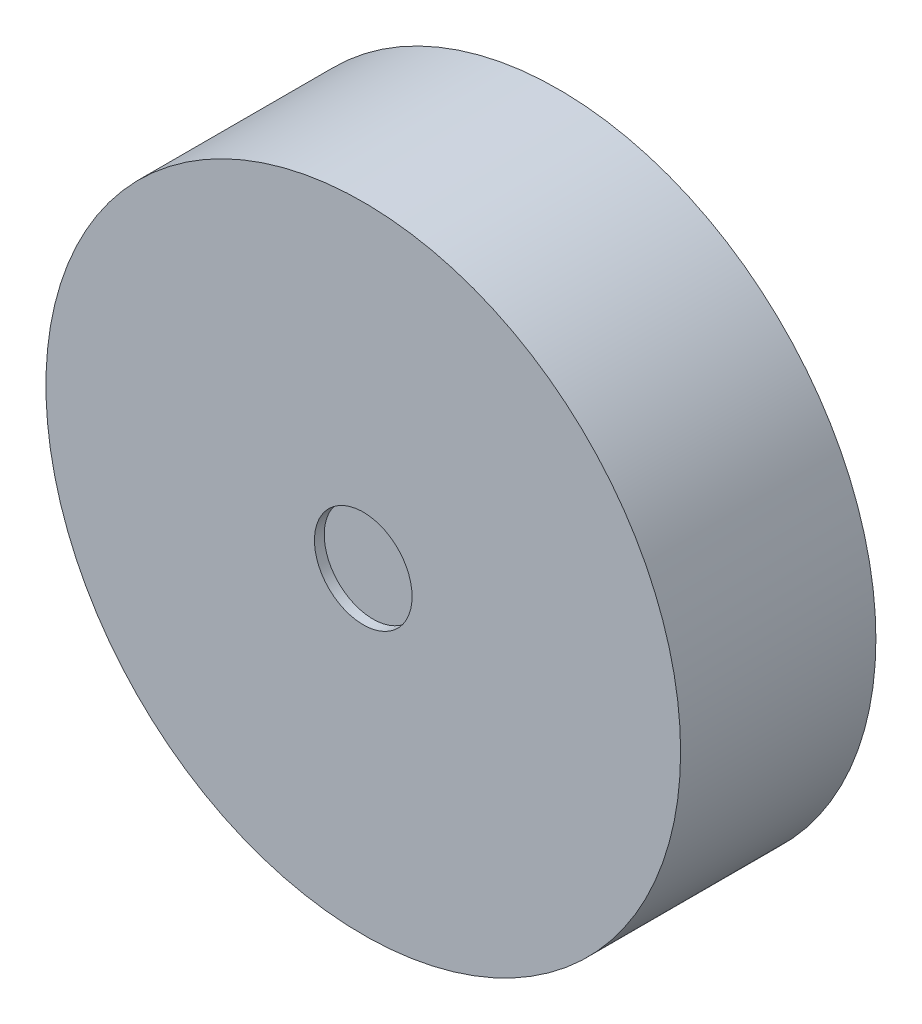
ISO-10303-21;
HEADER;
FILE_DESCRIPTION(('STEP AP214'),'2;1');
FILE_NAME('part.step','',(''),(''),'','','');
FILE_SCHEMA(('AUTOMOTIVE_DESIGN { 1 0 10303 214 1 1 1 1 }'));
ENDSEC;
DATA;
#1=APPLICATION_CONTEXT('core data for automotive mechanical design processes');
#2=APPLICATION_PROTOCOL_DEFINITION('international standard','automotive_design',2000,#1);
#3=PRODUCT_CONTEXT('',#1,'mechanical');
#4=PRODUCT('Part','Part','',(#3));
#5=PRODUCT_RELATED_PRODUCT_CATEGORY('part','',(#4));
#6=PRODUCT_DEFINITION_FORMATION('','',#4);
#7=PRODUCT_DEFINITION_CONTEXT('part definition',#1,'design');
#8=PRODUCT_DEFINITION('design','',#6,#7);
#9=PRODUCT_DEFINITION_SHAPE('','',#8);
#10=(LENGTH_UNIT() NAMED_UNIT(*) SI_UNIT(.MILLI.,.METRE.));
#11=(NAMED_UNIT(*) PLANE_ANGLE_UNIT() SI_UNIT($,.RADIAN.));
#12=(NAMED_UNIT(*) SI_UNIT($,.STERADIAN.) SOLID_ANGLE_UNIT());
#13=UNCERTAINTY_MEASURE_WITH_UNIT(LENGTH_MEASURE(1.E-05),#10,'distance_accuracy_value','');
#14=(GEOMETRIC_REPRESENTATION_CONTEXT(3) GLOBAL_UNCERTAINTY_ASSIGNED_CONTEXT((#13)) GLOBAL_UNIT_ASSIGNED_CONTEXT((#10,
#11,#12)) REPRESENTATION_CONTEXT('',''));
#15=CARTESIAN_POINT('',(0.,0.,0.));
#16=DIRECTION('',(0.,0.,1.));
#17=DIRECTION('',(1.,0.,0.));
#18=AXIS2_PLACEMENT_3D('',#15,#16,#17);
#19=CARTESIAN_POINT('',(0.,0.,20.));
#20=DIRECTION('',(0.,0.,-1.));
#21=DIRECTION('',(-1.,0.,0.));
#22=AXIS2_PLACEMENT_3D('',#19,#20,#21);
#23=CYLINDRICAL_SURFACE('',#22,32.5);
#24=CARTESIAN_POINT('',(0.,0.,20.));
#25=DIRECTION('',(0.,0.,1.));
#26=DIRECTION('',(1.,0.,0.));
#27=AXIS2_PLACEMENT_3D('',#24,#25,#26);
#28=CIRCLE('',#27,32.5);
#29=CARTESIAN_POINT('',(32.5,0.,20.));
#30=VERTEX_POINT('',#29);
#31=EDGE_CURVE('E10',#30,#30,#28,.T.);
#32=ORIENTED_EDGE('',*,*,#31,.F.);
#33=EDGE_LOOP('',(#32));
#34=FACE_BOUND('',#33,.T.);
#35=CARTESIAN_POINT('',(0.,0.,0.));
#36=DIRECTION('',(0.,0.,1.));
#37=DIRECTION('',(1.,0.,0.));
#38=AXIS2_PLACEMENT_3D('',#35,#36,#37);
#39=CIRCLE('',#38,32.5);
#40=CARTESIAN_POINT('',(32.5,0.,0.));
#41=VERTEX_POINT('',#40);
#42=EDGE_CURVE('E44',#41,#41,#39,.T.);
#43=ORIENTED_EDGE('',*,*,#42,.T.);
#44=EDGE_LOOP('',(#43));
#45=FACE_BOUND('',#44,.T.);
#46=ADVANCED_FACE('F36',(#34,#45),#23,.T.);
#47=CARTESIAN_POINT('',(0.,0.,20.));
#48=DIRECTION('',(0.,0.,1.));
#49=DIRECTION('',(1.,0.,0.));
#50=AXIS2_PLACEMENT_3D('',#47,#48,#49);
#51=PLANE('',#50);
#52=CARTESIAN_POINT('',(0.,0.,20.));
#53=DIRECTION('',(0.,0.,1.));
#54=DIRECTION('',(1.,0.,0.));
#55=AXIS2_PLACEMENT_3D('',#52,#53,#54);
#56=CIRCLE('',#55,5.);
#57=CARTESIAN_POINT('',(5.,0.,20.));
#58=VERTEX_POINT('',#57);
#59=EDGE_CURVE('E52',#58,#58,#56,.T.);
#60=ORIENTED_EDGE('',*,*,#59,.F.);
#61=EDGE_LOOP('',(#60));
#62=FACE_BOUND('',#61,.T.);
#63=ORIENTED_EDGE('',*,*,#31,.T.);
#64=EDGE_LOOP('',(#63));
#65=FACE_BOUND('',#64,.T.);
#66=ADVANCED_FACE('F124',(#62,#65),#51,.T.);
#67=CARTESIAN_POINT('',(0.,0.,0.));
#68=DIRECTION('',(0.,0.,1.));
#69=DIRECTION('',(1.,0.,0.));
#70=AXIS2_PLACEMENT_3D('',#67,#68,#69);
#71=PLANE('',#70);
#72=CARTESIAN_POINT('',(0.,0.,0.));
#73=DIRECTION('',(0.,0.,-1.));
#74=DIRECTION('',(-1.,0.,0.));
#75=AXIS2_PLACEMENT_3D('',#72,#73,#74);
#76=CIRCLE('',#75,5.);
#77=CARTESIAN_POINT('',(-5.,0.,0.));
#78=VERTEX_POINT('',#77);
#79=EDGE_CURVE('E95',#78,#78,#76,.T.);
#80=ORIENTED_EDGE('',*,*,#79,.F.);
#81=EDGE_LOOP('',(#80));
#82=FACE_BOUND('',#81,.T.);
#83=CARTESIAN_POINT('',(5.5,9.,0.));
#84=DIRECTION('',(0.,0.,-1.));
#85=DIRECTION('',(-1.,0.,0.));
#86=AXIS2_PLACEMENT_3D('',#83,#84,#85);
#87=CIRCLE('',#86,1.5);
#88=CARTESIAN_POINT('',(4.,9.,0.));
#89=VERTEX_POINT('',#88);
#90=EDGE_CURVE('E81',#89,#89,#87,.T.);
#91=ORIENTED_EDGE('',*,*,#90,.F.);
#92=EDGE_LOOP('',(#91));
#93=FACE_BOUND('',#92,.T.);
#94=CARTESIAN_POINT('',(-5.5,-9.,0.));
#95=DIRECTION('',(0.,0.,-1.));
#96=DIRECTION('',(-1.,0.,0.));
#97=AXIS2_PLACEMENT_3D('',#94,#95,#96);
#98=CIRCLE('',#97,1.5);
#99=CARTESIAN_POINT('',(-7.,-9.,0.));
#100=VERTEX_POINT('',#99);
#101=EDGE_CURVE('E72',#100,#100,#98,.T.);
#102=ORIENTED_EDGE('',*,*,#101,.F.);
#103=EDGE_LOOP('',(#102));
#104=FACE_BOUND('',#103,.T.);
#105=CARTESIAN_POINT('',(5.5,-9.,0.));
#106=DIRECTION('',(0.,0.,-1.));
#107=DIRECTION('',(-1.,0.,0.));
#108=AXIS2_PLACEMENT_3D('',#105,#106,#107);
#109=CIRCLE('',#108,1.5);
#110=CARTESIAN_POINT('',(4.,-9.,0.));
#111=VERTEX_POINT('',#110);
#112=EDGE_CURVE('E88',#111,#111,#109,.T.);
#113=ORIENTED_EDGE('',*,*,#112,.F.);
#114=EDGE_LOOP('',(#113));
#115=FACE_BOUND('',#114,.T.);
#116=CARTESIAN_POINT('',(-5.5,9.,0.));
#117=DIRECTION('',(0.,0.,-1.));
#118=DIRECTION('',(-1.,0.,0.));
#119=AXIS2_PLACEMENT_3D('',#116,#117,#118);
#120=CIRCLE('',#119,1.5);
#121=CARTESIAN_POINT('',(-7.,9.,0.));
#122=VERTEX_POINT('',#121);
#123=EDGE_CURVE('E64',#122,#122,#120,.T.);
#124=ORIENTED_EDGE('',*,*,#123,.F.);
#125=EDGE_LOOP('',(#124));
#126=FACE_BOUND('',#125,.T.);
#127=ORIENTED_EDGE('',*,*,#42,.F.);
#128=EDGE_LOOP('',(#127));
#129=FACE_BOUND('',#128,.T.);
#130=ADVANCED_FACE('F129',(#82,#93,#104,#115,#126,#129),#71,.F.);
#131=CARTESIAN_POINT('',(0.,0.,19.));
#132=DIRECTION('',(0.,0.,1.));
#133=DIRECTION('',(1.,0.,0.));
#134=AXIS2_PLACEMENT_3D('',#131,#132,#133);
#135=CYLINDRICAL_SURFACE('',#134,5.);
#136=CARTESIAN_POINT('',(0.,0.,19.));
#137=DIRECTION('',(0.,0.,1.));
#138=DIRECTION('',(1.,0.,0.));
#139=AXIS2_PLACEMENT_3D('',#136,#137,#138);
#140=CIRCLE('',#139,5.);
#141=CARTESIAN_POINT('',(5.,0.,19.));
#142=VERTEX_POINT('',#141);
#143=EDGE_CURVE('E50',#142,#142,#140,.T.);
#144=ORIENTED_EDGE('',*,*,#143,.F.);
#145=EDGE_LOOP('',(#144));
#146=FACE_BOUND('',#145,.T.);
#147=ORIENTED_EDGE('',*,*,#59,.T.);
#148=EDGE_LOOP('',(#147));
#149=FACE_BOUND('',#148,.T.);
#150=ADVANCED_FACE('F136',(#146,#149),#135,.F.);
#151=CARTESIAN_POINT('',(0.,0.,19.));
#152=DIRECTION('',(0.,0.,1.));
#153=DIRECTION('',(1.,0.,0.));
#154=AXIS2_PLACEMENT_3D('',#151,#152,#153);
#155=PLANE('',#154);
#156=ORIENTED_EDGE('',*,*,#143,.T.);
#157=EDGE_LOOP('',(#156));
#158=FACE_BOUND('',#157,.T.);
#159=ADVANCED_FACE('F141',(#158),#155,.T.);
#160=CARTESIAN_POINT('',(-5.5,9.,2.));
#161=DIRECTION('',(0.,0.,-1.));
#162=DIRECTION('',(-1.,0.,0.));
#163=AXIS2_PLACEMENT_3D('',#160,#161,#162);
#164=CYLINDRICAL_SURFACE('',#163,1.5);
#165=CARTESIAN_POINT('',(-5.5,9.,2.));
#166=DIRECTION('',(0.,0.,-1.));
#167=DIRECTION('',(-1.,0.,0.));
#168=AXIS2_PLACEMENT_3D('',#165,#166,#167);
#169=CIRCLE('',#168,1.5);
#170=CARTESIAN_POINT('',(-7.,9.,2.));
#171=VERTEX_POINT('',#170);
#172=EDGE_CURVE('E63',#171,#171,#169,.T.);
#173=ORIENTED_EDGE('',*,*,#172,.F.);
#174=EDGE_LOOP('',(#173));
#175=FACE_BOUND('',#174,.T.);
#176=ORIENTED_EDGE('',*,*,#123,.T.);
#177=EDGE_LOOP('',(#176));
#178=FACE_BOUND('',#177,.T.);
#179=ADVANCED_FACE('F147',(#175,#178),#164,.F.);
#180=CARTESIAN_POINT('',(-5.5,9.,2.));
#181=DIRECTION('',(0.,0.,-1.));
#182=DIRECTION('',(-1.,0.,0.));
#183=AXIS2_PLACEMENT_3D('',#180,#181,#182);
#184=PLANE('',#183);
#185=ORIENTED_EDGE('',*,*,#172,.T.);
#186=EDGE_LOOP('',(#185));
#187=FACE_BOUND('',#186,.T.);
#188=ADVANCED_FACE('F152',(#187),#184,.T.);
#189=CARTESIAN_POINT('',(5.5,-9.,2.));
#190=DIRECTION('',(0.,0.,-1.));
#191=DIRECTION('',(-1.,0.,0.));
#192=AXIS2_PLACEMENT_3D('',#189,#190,#191);
#193=CYLINDRICAL_SURFACE('',#192,1.5);
#194=CARTESIAN_POINT('',(5.5,-9.,2.));
#195=DIRECTION('',(0.,0.,-1.));
#196=DIRECTION('',(-1.,0.,0.));
#197=AXIS2_PLACEMENT_3D('',#194,#195,#196);
#198=CIRCLE('',#197,1.5);
#199=CARTESIAN_POINT('',(4.,-9.,2.));
#200=VERTEX_POINT('',#199);
#201=EDGE_CURVE('E77',#200,#200,#198,.T.);
#202=ORIENTED_EDGE('',*,*,#201,.F.);
#203=EDGE_LOOP('',(#202));
#204=FACE_BOUND('',#203,.T.);
#205=ORIENTED_EDGE('',*,*,#112,.T.);
#206=EDGE_LOOP('',(#205));
#207=FACE_BOUND('',#206,.T.);
#208=ADVANCED_FACE('F161',(#204,#207),#193,.F.);
#209=CARTESIAN_POINT('',(5.5,-9.,2.));
#210=DIRECTION('',(0.,0.,-1.));
#211=DIRECTION('',(-1.,0.,0.));
#212=AXIS2_PLACEMENT_3D('',#209,#210,#211);
#213=PLANE('',#212);
#214=ORIENTED_EDGE('',*,*,#201,.T.);
#215=EDGE_LOOP('',(#214));
#216=FACE_BOUND('',#215,.T.);
#217=ADVANCED_FACE('F171',(#216),#213,.T.);
#218=CARTESIAN_POINT('',(-5.5,-9.,2.));
#219=DIRECTION('',(0.,0.,-1.));
#220=DIRECTION('',(-1.,0.,0.));
#221=AXIS2_PLACEMENT_3D('',#218,#219,#220);
#222=CYLINDRICAL_SURFACE('',#221,1.5);
#223=CARTESIAN_POINT('',(-5.5,-9.,2.));
#224=DIRECTION('',(0.,0.,-1.));
#225=DIRECTION('',(-1.,0.,0.));
#226=AXIS2_PLACEMENT_3D('',#223,#224,#225);
#227=CIRCLE('',#226,1.5);
#228=CARTESIAN_POINT('',(-7.,-9.,2.));
#229=VERTEX_POINT('',#228);
#230=EDGE_CURVE('E76',#229,#229,#227,.T.);
#231=ORIENTED_EDGE('',*,*,#230,.F.);
#232=EDGE_LOOP('',(#231));
#233=FACE_BOUND('',#232,.T.);
#234=ORIENTED_EDGE('',*,*,#101,.T.);
#235=EDGE_LOOP('',(#234));
#236=FACE_BOUND('',#235,.T.);
#237=ADVANCED_FACE('F167',(#233,#236),#222,.F.);
#238=CARTESIAN_POINT('',(-5.5,-9.,2.));
#239=DIRECTION('',(0.,0.,-1.));
#240=DIRECTION('',(-1.,0.,0.));
#241=AXIS2_PLACEMENT_3D('',#238,#239,#240);
#242=PLANE('',#241);
#243=ORIENTED_EDGE('',*,*,#230,.T.);
#244=EDGE_LOOP('',(#243));
#245=FACE_BOUND('',#244,.T.);
#246=ADVANCED_FACE('F170',(#245),#242,.T.);
#247=CARTESIAN_POINT('',(5.5,9.,2.));
#248=DIRECTION('',(0.,0.,-1.));
#249=DIRECTION('',(-1.,0.,0.));
#250=AXIS2_PLACEMENT_3D('',#247,#248,#249);
#251=CYLINDRICAL_SURFACE('',#250,1.5);
#252=CARTESIAN_POINT('',(5.5,9.,2.));
#253=DIRECTION('',(0.,0.,-1.));
#254=DIRECTION('',(-1.,0.,0.));
#255=AXIS2_PLACEMENT_3D('',#252,#253,#254);
#256=CIRCLE('',#255,1.5);
#257=CARTESIAN_POINT('',(4.,9.,2.));
#258=VERTEX_POINT('',#257);
#259=EDGE_CURVE('E68',#258,#258,#256,.T.);
#260=ORIENTED_EDGE('',*,*,#259,.F.);
#261=EDGE_LOOP('',(#260));
#262=FACE_BOUND('',#261,.T.);
#263=ORIENTED_EDGE('',*,*,#90,.T.);
#264=EDGE_LOOP('',(#263));
#265=FACE_BOUND('',#264,.T.);
#266=ADVANCED_FACE('F175',(#262,#265),#251,.F.);
#267=CARTESIAN_POINT('',(5.5,9.,2.));
#268=DIRECTION('',(0.,0.,-1.));
#269=DIRECTION('',(-1.,0.,0.));
#270=AXIS2_PLACEMENT_3D('',#267,#268,#269);
#271=PLANE('',#270);
#272=ORIENTED_EDGE('',*,*,#259,.T.);
#273=EDGE_LOOP('',(#272));
#274=FACE_BOUND('',#273,.T.);
#275=ADVANCED_FACE('F179',(#274),#271,.T.);
#276=CARTESIAN_POINT('',(0.,0.,2.));
#277=DIRECTION('',(0.,0.,-1.));
#278=DIRECTION('',(-1.,0.,0.));
#279=AXIS2_PLACEMENT_3D('',#276,#277,#278);
#280=PLANE('',#279);
#281=CARTESIAN_POINT('',(0.,0.,2.));
#282=DIRECTION('',(0.,0.,-1.));
#283=DIRECTION('',(-1.,0.,0.));
#284=AXIS2_PLACEMENT_3D('',#281,#282,#283);
#285=CIRCLE('',#284,5.);
#286=CARTESIAN_POINT('',(-5.,0.,2.));
#287=VERTEX_POINT('',#286);
#288=EDGE_CURVE('E99',#287,#287,#285,.T.);
#289=ORIENTED_EDGE('',*,*,#288,.T.);
#290=EDGE_LOOP('',(#289));
#291=FACE_BOUND('',#290,.T.);
#292=CARTESIAN_POINT('',(0.,0.,2.));
#293=DIRECTION('',(0.,0.,-1.));
#294=DIRECTION('',(-1.,0.,0.));
#295=AXIS2_PLACEMENT_3D('',#292,#293,#294);
#296=CIRCLE('',#295,3.05);
#297=CARTESIAN_POINT('',(-3.05,0.,2.));
#298=VERTEX_POINT('',#297);
#299=EDGE_CURVE('E39',#298,#298,#296,.F.);
#300=ORIENTED_EDGE('',*,*,#299,.T.);
#301=EDGE_LOOP('',(#300));
#302=FACE_BOUND('',#301,.T.);
#303=ADVANCED_FACE('F108',(#291,#302),#280,.T.);
#304=CARTESIAN_POINT('',(0.,0.,2.));
#305=DIRECTION('',(0.,0.,-1.));
#306=DIRECTION('',(-1.,0.,0.));
#307=AXIS2_PLACEMENT_3D('',#304,#305,#306);
#308=CYLINDRICAL_SURFACE('',#307,5.);
#309=ORIENTED_EDGE('',*,*,#288,.F.);
#310=EDGE_LOOP('',(#309));
#311=FACE_BOUND('',#310,.T.);
#312=ORIENTED_EDGE('',*,*,#79,.T.);
#313=EDGE_LOOP('',(#312));
#314=FACE_BOUND('',#313,.T.);
#315=ADVANCED_FACE('F118',(#311,#314),#308,.F.);
#316=CARTESIAN_POINT('',(0.,0.,4.5));
#317=DIRECTION('',(0.,0.,-1.));
#318=DIRECTION('',(-1.,0.,0.));
#319=AXIS2_PLACEMENT_3D('',#316,#317,#318);
#320=PLANE('',#319);
#321=CARTESIAN_POINT('',(0.,0.,4.5));
#322=DIRECTION('',(0.,0.,-1.));
#323=DIRECTION('',(-1.,0.,0.));
#324=AXIS2_PLACEMENT_3D('',#321,#322,#323);
#325=CIRCLE('',#324,3.05);
#326=CARTESIAN_POINT('',(-3.05,0.,4.5));
#327=VERTEX_POINT('',#326);
#328=EDGE_CURVE('E56',#327,#327,#325,.T.);
#329=ORIENTED_EDGE('',*,*,#328,.T.);
#330=EDGE_LOOP('',(#329));
#331=FACE_BOUND('',#330,.T.);
#332=ADVANCED_FACE('F112',(#331),#320,.T.);
#333=CARTESIAN_POINT('',(0.,0.,4.5));
#334=DIRECTION('',(0.,0.,-1.));
#335=DIRECTION('',(-1.,0.,0.));
#336=AXIS2_PLACEMENT_3D('',#333,#334,#335);
#337=CYLINDRICAL_SURFACE('',#336,3.05);
#338=ORIENTED_EDGE('',*,*,#328,.F.);
#339=EDGE_LOOP('',(#338));
#340=FACE_BOUND('',#339,.T.);
#341=ORIENTED_EDGE('',*,*,#299,.F.);
#342=EDGE_LOOP('',(#341));
#343=FACE_BOUND('',#342,.T.);
#344=ADVANCED_FACE('F110',(#340,#343),#337,.F.);
#345=CLOSED_SHELL('',(#46,#66,#130,#150,#159,#179,#188,#208,#217,#237,#246,#266,#275,#303,#315,
#332,#344));
#346=MANIFOLD_SOLID_BREP('B2',#345);
#347=ADVANCED_BREP_SHAPE_REPRESENTATION('',(#18,#346),#14);
#348=SHAPE_DEFINITION_REPRESENTATION(#9,#347);
ENDSEC;
END-ISO-10303-21;
